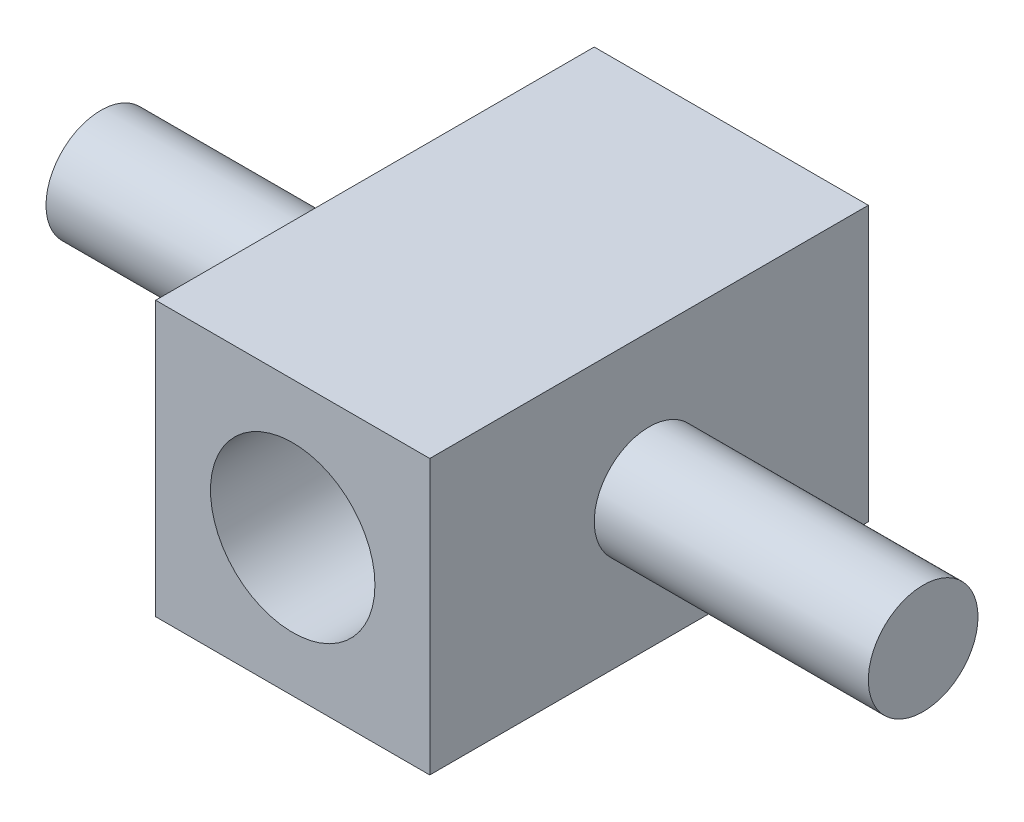
ISO-10303-21;
HEADER;
FILE_DESCRIPTION(('STEP AP214'),'2;1');
FILE_NAME('part.step','',(''),(''),'','','');
FILE_SCHEMA(('AUTOMOTIVE_DESIGN { 1 0 10303 214 1 1 1 1 }'));
ENDSEC;
DATA;
#1=APPLICATION_CONTEXT('core data for automotive mechanical design processes');
#2=APPLICATION_PROTOCOL_DEFINITION('international standard','automotive_design',2000,#1);
#3=PRODUCT_CONTEXT('',#1,'mechanical');
#4=PRODUCT('Part','Part','',(#3));
#5=PRODUCT_RELATED_PRODUCT_CATEGORY('part','',(#4));
#6=PRODUCT_DEFINITION_FORMATION('','',#4);
#7=PRODUCT_DEFINITION_CONTEXT('part definition',#1,'design');
#8=PRODUCT_DEFINITION('design','',#6,#7);
#9=PRODUCT_DEFINITION_SHAPE('','',#8);
#10=(LENGTH_UNIT() NAMED_UNIT(*) SI_UNIT(.MILLI.,.METRE.));
#11=(NAMED_UNIT(*) PLANE_ANGLE_UNIT() SI_UNIT($,.RADIAN.));
#12=(NAMED_UNIT(*) SI_UNIT($,.STERADIAN.) SOLID_ANGLE_UNIT());
#13=UNCERTAINTY_MEASURE_WITH_UNIT(LENGTH_MEASURE(1.E-05),#10,'distance_accuracy_value','');
#14=(GEOMETRIC_REPRESENTATION_CONTEXT(3) GLOBAL_UNCERTAINTY_ASSIGNED_CONTEXT((#13)) GLOBAL_UNIT_ASSIGNED_CONTEXT((#10,
#11,#12)) REPRESENTATION_CONTEXT('',''));
#15=CARTESIAN_POINT('',(0.,0.,0.));
#16=DIRECTION('',(0.,0.,1.));
#17=DIRECTION('',(1.,0.,0.));
#18=AXIS2_PLACEMENT_3D('',#15,#16,#17);
#19=CARTESIAN_POINT('',(-25.4,-25.4,-40.64));
#20=DIRECTION('',(-1.,0.,0.));
#21=DIRECTION('',(0.,0.,1.));
#22=AXIS2_PLACEMENT_3D('',#19,#20,#21);
#23=PLANE('',#22);
#24=CARTESIAN_POINT('',(-25.4,0.,0.));
#25=DIRECTION('',(-1.,0.,0.));
#26=DIRECTION('',(0.,0.,1.));
#27=AXIS2_PLACEMENT_3D('',#24,#25,#26);
#28=CIRCLE('',#27,10.16);
#29=CARTESIAN_POINT('',(-25.4,0.,10.16));
#30=VERTEX_POINT('',#29);
#31=EDGE_CURVE('E53',#30,#30,#28,.T.);
#32=ORIENTED_EDGE('',*,*,#31,.F.);
#33=EDGE_LOOP('',(#32));
#34=FACE_BOUND('',#33,.T.);
#35=DIRECTION('',(0.,0.,1.));
#36=VECTOR('',#35,1.);
#37=CARTESIAN_POINT('',(-25.4,-25.4,-40.64));
#38=LINE('',#37,#36);
#39=CARTESIAN_POINT('',(-25.4,-25.4,-40.64));
#40=VERTEX_POINT('',#39);
#41=CARTESIAN_POINT('',(-25.4,-25.4,40.64));
#42=VERTEX_POINT('',#41);
#43=EDGE_CURVE('E47',#40,#42,#38,.T.);
#44=ORIENTED_EDGE('',*,*,#43,.T.);
#45=DIRECTION('',(0.,-1.,0.));
#46=VECTOR('',#45,1.);
#47=CARTESIAN_POINT('',(-25.4,-25.4,40.64));
#48=LINE('',#47,#46);
#49=CARTESIAN_POINT('',(-25.4,25.4,40.64));
#50=VERTEX_POINT('',#49);
#51=EDGE_CURVE('E88',#50,#42,#48,.T.);
#52=ORIENTED_EDGE('',*,*,#51,.F.);
#53=DIRECTION('',(0.,0.,1.));
#54=VECTOR('',#53,1.);
#55=CARTESIAN_POINT('',(-25.4,25.4,-40.64));
#56=LINE('',#55,#54);
#57=CARTESIAN_POINT('',(-25.4,25.4,-40.64));
#58=VERTEX_POINT('',#57);
#59=EDGE_CURVE('E61',#58,#50,#56,.T.);
#60=ORIENTED_EDGE('',*,*,#59,.F.);
#61=DIRECTION('',(0.,-1.,0.));
#62=VECTOR('',#61,1.);
#63=CARTESIAN_POINT('',(-25.4,-25.4,-40.64));
#64=LINE('',#63,#62);
#65=EDGE_CURVE('E89',#58,#40,#64,.T.);
#66=ORIENTED_EDGE('',*,*,#65,.T.);
#67=EDGE_LOOP('',(#44,#52,#60,#66));
#68=FACE_BOUND('',#67,.T.);
#69=ADVANCED_FACE('F44',(#34,#68),#23,.T.);
#70=CARTESIAN_POINT('',(-25.4,25.4,-40.64));
#71=DIRECTION('',(0.,1.,0.));
#72=DIRECTION('',(0.,0.,1.));
#73=AXIS2_PLACEMENT_3D('',#70,#71,#72);
#74=PLANE('',#73);
#75=ORIENTED_EDGE('',*,*,#59,.T.);
#76=DIRECTION('',(-1.,0.,0.));
#77=VECTOR('',#76,1.);
#78=CARTESIAN_POINT('',(-25.4,25.4,40.64));
#79=LINE('',#78,#77);
#80=CARTESIAN_POINT('',(25.4,25.4,40.64));
#81=VERTEX_POINT('',#80);
#82=EDGE_CURVE('E108',#81,#50,#79,.T.);
#83=ORIENTED_EDGE('',*,*,#82,.F.);
#84=DIRECTION('',(0.,0.,1.));
#85=VECTOR('',#84,1.);
#86=CARTESIAN_POINT('',(25.4,25.4,-40.64));
#87=LINE('',#86,#85);
#88=CARTESIAN_POINT('',(25.4,25.4,-40.64));
#89=VERTEX_POINT('',#88);
#90=EDGE_CURVE('E69',#89,#81,#87,.T.);
#91=ORIENTED_EDGE('',*,*,#90,.F.);
#92=DIRECTION('',(-1.,0.,0.));
#93=VECTOR('',#92,1.);
#94=CARTESIAN_POINT('',(-25.4,25.4,-40.64));
#95=LINE('',#94,#93);
#96=EDGE_CURVE('E95',#89,#58,#95,.T.);
#97=ORIENTED_EDGE('',*,*,#96,.T.);
#98=EDGE_LOOP('',(#75,#83,#91,#97));
#99=FACE_BOUND('',#98,.T.);
#100=ADVANCED_FACE('F165',(#99),#74,.T.);
#101=CARTESIAN_POINT('',(25.4,-25.4,-40.64));
#102=DIRECTION('',(1.,0.,0.));
#103=DIRECTION('',(0.,0.,-1.));
#104=AXIS2_PLACEMENT_3D('',#101,#102,#103);
#105=PLANE('',#104);
#106=CARTESIAN_POINT('',(25.4,0.,0.));
#107=DIRECTION('',(1.,0.,0.));
#108=DIRECTION('',(0.,0.,-1.));
#109=AXIS2_PLACEMENT_3D('',#106,#107,#108);
#110=CIRCLE('',#109,10.16);
#111=CARTESIAN_POINT('',(25.4,0.,-10.16));
#112=VERTEX_POINT('',#111);
#113=EDGE_CURVE('E11',#112,#112,#110,.T.);
#114=ORIENTED_EDGE('',*,*,#113,.F.);
#115=EDGE_LOOP('',(#114));
#116=FACE_BOUND('',#115,.T.);
#117=ORIENTED_EDGE('',*,*,#90,.T.);
#118=DIRECTION('',(0.,1.,0.));
#119=VECTOR('',#118,1.);
#120=CARTESIAN_POINT('',(25.4,-25.4,40.64));
#121=LINE('',#120,#119);
#122=CARTESIAN_POINT('',(25.4,-25.4,40.64));
#123=VERTEX_POINT('',#122);
#124=EDGE_CURVE('E103',#123,#81,#121,.T.);
#125=ORIENTED_EDGE('',*,*,#124,.F.);
#126=DIRECTION('',(0.,0.,1.));
#127=VECTOR('',#126,1.);
#128=CARTESIAN_POINT('',(25.4,-25.4,-40.64));
#129=LINE('',#128,#127);
#130=CARTESIAN_POINT('',(25.4,-25.4,-40.64));
#131=VERTEX_POINT('',#130);
#132=EDGE_CURVE('E94',#131,#123,#129,.T.);
#133=ORIENTED_EDGE('',*,*,#132,.F.);
#134=DIRECTION('',(0.,1.,0.));
#135=VECTOR('',#134,1.);
#136=CARTESIAN_POINT('',(25.4,-25.4,-40.64));
#137=LINE('',#136,#135);
#138=EDGE_CURVE('E131',#131,#89,#137,.T.);
#139=ORIENTED_EDGE('',*,*,#138,.T.);
#140=EDGE_LOOP('',(#117,#125,#133,#139));
#141=FACE_BOUND('',#140,.T.);
#142=ADVANCED_FACE('F162',(#116,#141),#105,.T.);
#143=CARTESIAN_POINT('',(-25.4,-25.4,-40.64));
#144=DIRECTION('',(0.,-1.,0.));
#145=DIRECTION('',(0.,0.,-1.));
#146=AXIS2_PLACEMENT_3D('',#143,#144,#145);
#147=PLANE('',#146);
#148=ORIENTED_EDGE('',*,*,#132,.T.);
#149=DIRECTION('',(1.,0.,0.));
#150=VECTOR('',#149,1.);
#151=CARTESIAN_POINT('',(-25.4,-25.4,40.64));
#152=LINE('',#151,#150);
#153=EDGE_CURVE('E97',#42,#123,#152,.T.);
#154=ORIENTED_EDGE('',*,*,#153,.F.);
#155=ORIENTED_EDGE('',*,*,#43,.F.);
#156=DIRECTION('',(1.,0.,0.));
#157=VECTOR('',#156,1.);
#158=CARTESIAN_POINT('',(-25.4,-25.4,-40.64));
#159=LINE('',#158,#157);
#160=EDGE_CURVE('E128',#40,#131,#159,.T.);
#161=ORIENTED_EDGE('',*,*,#160,.T.);
#162=EDGE_LOOP('',(#148,#154,#155,#161));
#163=FACE_BOUND('',#162,.T.);
#164=ADVANCED_FACE('F98',(#163),#147,.T.);
#165=CARTESIAN_POINT('',(0.,0.,-40.64));
#166=DIRECTION('',(0.,0.,-1.));
#167=DIRECTION('',(-1.,0.,0.));
#168=AXIS2_PLACEMENT_3D('',#165,#166,#167);
#169=PLANE('',#168);
#170=CARTESIAN_POINT('',(0.,0.,-40.64));
#171=DIRECTION('',(0.,0.,1.));
#172=DIRECTION('',(1.,0.,0.));
#173=AXIS2_PLACEMENT_3D('',#170,#171,#172);
#174=CIRCLE('',#173,15.24);
#175=CARTESIAN_POINT('',(15.24,0.,-40.64));
#176=VERTEX_POINT('',#175);
#177=EDGE_CURVE('E122',#176,#176,#174,.T.);
#178=ORIENTED_EDGE('',*,*,#177,.T.);
#179=EDGE_LOOP('',(#178));
#180=FACE_BOUND('',#179,.T.);
#181=ORIENTED_EDGE('',*,*,#65,.F.);
#182=ORIENTED_EDGE('',*,*,#96,.F.);
#183=ORIENTED_EDGE('',*,*,#138,.F.);
#184=ORIENTED_EDGE('',*,*,#160,.F.);
#185=EDGE_LOOP('',(#181,#182,#183,#184));
#186=FACE_BOUND('',#185,.T.);
#187=ADVANCED_FACE('F170',(#180,#186),#169,.T.);
#188=CARTESIAN_POINT('',(0.,0.,-40.64));
#189=DIRECTION('',(0.,0.,1.));
#190=DIRECTION('',(1.,0.,0.));
#191=AXIS2_PLACEMENT_3D('',#188,#189,#190);
#192=CYLINDRICAL_SURFACE('',#191,15.24);
#193=ORIENTED_EDGE('',*,*,#177,.F.);
#194=EDGE_LOOP('',(#193));
#195=FACE_BOUND('',#194,.T.);
#196=CARTESIAN_POINT('',(0.,0.,40.64));
#197=DIRECTION('',(0.,0.,1.));
#198=DIRECTION('',(1.,0.,0.));
#199=AXIS2_PLACEMENT_3D('',#196,#197,#198);
#200=CIRCLE('',#199,15.24);
#201=CARTESIAN_POINT('',(15.24,0.,40.64));
#202=VERTEX_POINT('',#201);
#203=EDGE_CURVE('E110',#202,#202,#200,.T.);
#204=ORIENTED_EDGE('',*,*,#203,.T.);
#205=EDGE_LOOP('',(#204));
#206=FACE_BOUND('',#205,.T.);
#207=ADVANCED_FACE('F172',(#195,#206),#192,.F.);
#208=CARTESIAN_POINT('',(0.,0.,40.64));
#209=DIRECTION('',(0.,0.,-1.));
#210=DIRECTION('',(-1.,0.,0.));
#211=AXIS2_PLACEMENT_3D('',#208,#209,#210);
#212=PLANE('',#211);
#213=ORIENTED_EDGE('',*,*,#51,.T.);
#214=ORIENTED_EDGE('',*,*,#153,.T.);
#215=ORIENTED_EDGE('',*,*,#124,.T.);
#216=ORIENTED_EDGE('',*,*,#82,.T.);
#217=EDGE_LOOP('',(#213,#214,#215,#216));
#218=FACE_BOUND('',#217,.T.);
#219=ORIENTED_EDGE('',*,*,#203,.F.);
#220=EDGE_LOOP('',(#219));
#221=FACE_BOUND('',#220,.T.);
#222=ADVANCED_FACE('F106',(#218,#221),#212,.F.);
#223=CARTESIAN_POINT('',(-76.2,0.,0.));
#224=DIRECTION('',(1.,0.,0.));
#225=DIRECTION('',(0.,0.,-1.));
#226=AXIS2_PLACEMENT_3D('',#223,#224,#225);
#227=CYLINDRICAL_SURFACE('',#226,10.16);
#228=CARTESIAN_POINT('',(-76.2,0.,0.));
#229=DIRECTION('',(-1.,0.,0.));
#230=DIRECTION('',(0.,0.,1.));
#231=AXIS2_PLACEMENT_3D('',#228,#229,#230);
#232=CIRCLE('',#231,10.16);
#233=CARTESIAN_POINT('',(-76.2,0.,10.16));
#234=VERTEX_POINT('',#233);
#235=EDGE_CURVE('E114',#234,#234,#232,.T.);
#236=ORIENTED_EDGE('',*,*,#235,.F.);
#237=EDGE_LOOP('',(#236));
#238=FACE_BOUND('',#237,.T.);
#239=ORIENTED_EDGE('',*,*,#31,.T.);
#240=EDGE_LOOP('',(#239));
#241=FACE_BOUND('',#240,.T.);
#242=ADVANCED_FACE('F219',(#238,#241),#227,.T.);
#243=CARTESIAN_POINT('',(-76.2,0.,0.));
#244=DIRECTION('',(-1.,0.,0.));
#245=DIRECTION('',(0.,0.,1.));
#246=AXIS2_PLACEMENT_3D('',#243,#244,#245);
#247=PLANE('',#246);
#248=ORIENTED_EDGE('',*,*,#235,.T.);
#249=EDGE_LOOP('',(#248));
#250=FACE_BOUND('',#249,.T.);
#251=ADVANCED_FACE('F158',(#250),#247,.T.);
#252=CARTESIAN_POINT('',(76.2,0.,0.));
#253=DIRECTION('',(-1.,0.,0.));
#254=DIRECTION('',(0.,0.,1.));
#255=AXIS2_PLACEMENT_3D('',#252,#253,#254);
#256=CYLINDRICAL_SURFACE('',#255,10.16);
#257=CARTESIAN_POINT('',(76.2,0.,0.));
#258=DIRECTION('',(1.,0.,0.));
#259=DIRECTION('',(0.,0.,-1.));
#260=AXIS2_PLACEMENT_3D('',#257,#258,#259);
#261=CIRCLE('',#260,10.16);
#262=CARTESIAN_POINT('',(76.2,0.,-10.16));
#263=VERTEX_POINT('',#262);
#264=EDGE_CURVE('E147',#263,#263,#261,.T.);
#265=ORIENTED_EDGE('',*,*,#264,.F.);
#266=EDGE_LOOP('',(#265));
#267=FACE_BOUND('',#266,.T.);
#268=ORIENTED_EDGE('',*,*,#113,.T.);
#269=EDGE_LOOP('',(#268));
#270=FACE_BOUND('',#269,.T.);
#271=ADVANCED_FACE('F155',(#267,#270),#256,.T.);
#272=CARTESIAN_POINT('',(76.2,0.,0.));
#273=DIRECTION('',(1.,0.,0.));
#274=DIRECTION('',(0.,0.,-1.));
#275=AXIS2_PLACEMENT_3D('',#272,#273,#274);
#276=PLANE('',#275);
#277=ORIENTED_EDGE('',*,*,#264,.T.);
#278=EDGE_LOOP('',(#277));
#279=FACE_BOUND('',#278,.T.);
#280=ADVANCED_FACE('F153',(#279),#276,.T.);
#281=CLOSED_SHELL('',(#69,#100,#142,#164,#187,#207,#222,#242,#251,#271,#280));
#282=MANIFOLD_SOLID_BREP('B2',#281);
#283=ADVANCED_BREP_SHAPE_REPRESENTATION('',(#18,#282),#14);
#284=SHAPE_DEFINITION_REPRESENTATION(#9,#283);
ENDSEC;
END-ISO-10303-21;
